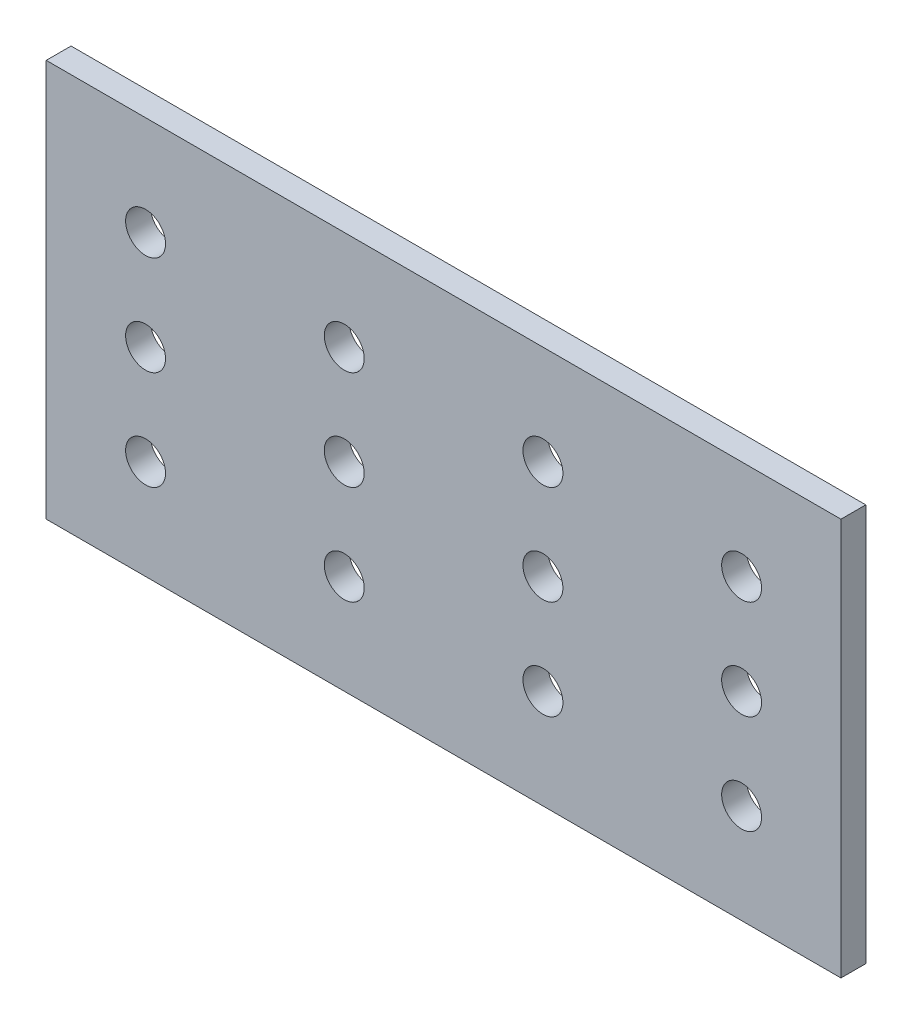
ISO-10303-21;
HEADER;
FILE_DESCRIPTION(('STEP AP214'),'2;1');
FILE_NAME('part.step','',(''),(''),'','','');
FILE_SCHEMA(('AUTOMOTIVE_DESIGN { 1 0 10303 214 1 1 1 1 }'));
ENDSEC;
DATA;
#1=APPLICATION_CONTEXT('core data for automotive mechanical design processes');
#2=APPLICATION_PROTOCOL_DEFINITION('international standard','automotive_design',2000,#1);
#3=PRODUCT_CONTEXT('',#1,'mechanical');
#4=PRODUCT('Part','Part','',(#3));
#5=PRODUCT_RELATED_PRODUCT_CATEGORY('part','',(#4));
#6=PRODUCT_DEFINITION_FORMATION('','',#4);
#7=PRODUCT_DEFINITION_CONTEXT('part definition',#1,'design');
#8=PRODUCT_DEFINITION('design','',#6,#7);
#9=PRODUCT_DEFINITION_SHAPE('','',#8);
#10=(LENGTH_UNIT() NAMED_UNIT(*) SI_UNIT(.MILLI.,.METRE.));
#11=(NAMED_UNIT(*) PLANE_ANGLE_UNIT() SI_UNIT($,.RADIAN.));
#12=(NAMED_UNIT(*) SI_UNIT($,.STERADIAN.) SOLID_ANGLE_UNIT());
#13=UNCERTAINTY_MEASURE_WITH_UNIT(LENGTH_MEASURE(1.E-05),#10,'distance_accuracy_value','');
#14=(GEOMETRIC_REPRESENTATION_CONTEXT(3) GLOBAL_UNCERTAINTY_ASSIGNED_CONTEXT((#13)) GLOBAL_UNIT_ASSIGNED_CONTEXT((#10,
#11,#12)) REPRESENTATION_CONTEXT('',''));
#15=CARTESIAN_POINT('',(0.,0.,0.));
#16=DIRECTION('',(0.,0.,1.));
#17=DIRECTION('',(1.,0.,0.));
#18=AXIS2_PLACEMENT_3D('',#15,#16,#17);
#19=CARTESIAN_POINT('',(-50.8,25.4,3.175));
#20=DIRECTION('',(1.,0.,0.));
#21=DIRECTION('',(0.,1.,0.));
#22=AXIS2_PLACEMENT_3D('',#19,#20,#21);
#23=PLANE('',#22);
#24=DIRECTION('',(0.,-1.,0.));
#25=VECTOR('',#24,1.);
#26=CARTESIAN_POINT('',(-50.8,25.4,0.));
#27=LINE('',#26,#25);
#28=CARTESIAN_POINT('',(-50.8,25.4,0.));
#29=VERTEX_POINT('',#28);
#30=CARTESIAN_POINT('',(-50.8,-25.4,0.));
#31=VERTEX_POINT('',#30);
#32=EDGE_CURVE('E96',#29,#31,#27,.T.);
#33=ORIENTED_EDGE('',*,*,#32,.T.);
#34=DIRECTION('',(0.,0.,-1.));
#35=VECTOR('',#34,1.);
#36=CARTESIAN_POINT('',(-50.8,-25.4,3.175));
#37=LINE('',#36,#35);
#38=CARTESIAN_POINT('',(-50.8,-25.4,3.175));
#39=VERTEX_POINT('',#38);
#40=EDGE_CURVE('E11',#39,#31,#37,.T.);
#41=ORIENTED_EDGE('',*,*,#40,.F.);
#42=DIRECTION('',(0.,-1.,0.));
#43=VECTOR('',#42,1.);
#44=CARTESIAN_POINT('',(-50.8,25.4,3.175));
#45=LINE('',#44,#43);
#46=CARTESIAN_POINT('',(-50.8,25.4,3.175));
#47=VERTEX_POINT('',#46);
#48=EDGE_CURVE('E84',#47,#39,#45,.T.);
#49=ORIENTED_EDGE('',*,*,#48,.F.);
#50=DIRECTION('',(0.,0.,-1.));
#51=VECTOR('',#50,1.);
#52=CARTESIAN_POINT('',(-50.8,25.4,3.175));
#53=LINE('',#52,#51);
#54=EDGE_CURVE('E92',#47,#29,#53,.T.);
#55=ORIENTED_EDGE('',*,*,#54,.T.);
#56=EDGE_LOOP('',(#33,#41,#49,#55));
#57=FACE_BOUND('',#56,.T.);
#58=ADVANCED_FACE('F33',(#57),#23,.F.);
#59=CARTESIAN_POINT('',(-50.8,-25.4,3.175));
#60=DIRECTION('',(0.,1.,0.));
#61=DIRECTION('',(0.,0.,1.));
#62=AXIS2_PLACEMENT_3D('',#59,#60,#61);
#63=PLANE('',#62);
#64=DIRECTION('',(1.,0.,0.));
#65=VECTOR('',#64,1.);
#66=CARTESIAN_POINT('',(-50.8,-25.4,0.));
#67=LINE('',#66,#65);
#68=CARTESIAN_POINT('',(50.8,-25.4,0.));
#69=VERTEX_POINT('',#68);
#70=EDGE_CURVE('E88',#31,#69,#67,.T.);
#71=ORIENTED_EDGE('',*,*,#70,.T.);
#72=DIRECTION('',(0.,0.,-1.));
#73=VECTOR('',#72,1.);
#74=CARTESIAN_POINT('',(50.8,-25.4,3.175));
#75=LINE('',#74,#73);
#76=CARTESIAN_POINT('',(50.8,-25.4,3.175));
#77=VERTEX_POINT('',#76);
#78=EDGE_CURVE('E41',#77,#69,#75,.T.);
#79=ORIENTED_EDGE('',*,*,#78,.F.);
#80=DIRECTION('',(1.,0.,0.));
#81=VECTOR('',#80,1.);
#82=CARTESIAN_POINT('',(-50.8,-25.4,3.175));
#83=LINE('',#82,#81);
#84=EDGE_CURVE('E79',#39,#77,#83,.T.);
#85=ORIENTED_EDGE('',*,*,#84,.F.);
#86=ORIENTED_EDGE('',*,*,#40,.T.);
#87=EDGE_LOOP('',(#71,#79,#85,#86));
#88=FACE_BOUND('',#87,.T.);
#89=ADVANCED_FACE('F87',(#88),#63,.F.);
#90=CARTESIAN_POINT('',(50.8,25.4,3.175));
#91=DIRECTION('',(-1.,0.,0.));
#92=DIRECTION('',(0.,0.,1.));
#93=AXIS2_PLACEMENT_3D('',#90,#91,#92);
#94=PLANE('',#93);
#95=DIRECTION('',(0.,1.,0.));
#96=VECTOR('',#95,1.);
#97=CARTESIAN_POINT('',(50.8,25.4,0.));
#98=LINE('',#97,#96);
#99=CARTESIAN_POINT('',(50.8,25.4,0.));
#100=VERTEX_POINT('',#99);
#101=EDGE_CURVE('E66',#69,#100,#98,.T.);
#102=ORIENTED_EDGE('',*,*,#101,.T.);
#103=DIRECTION('',(0.,0.,-1.));
#104=VECTOR('',#103,1.);
#105=CARTESIAN_POINT('',(50.8,25.4,3.175));
#106=LINE('',#105,#104);
#107=CARTESIAN_POINT('',(50.8,25.4,3.175));
#108=VERTEX_POINT('',#107);
#109=EDGE_CURVE('E89',#108,#100,#106,.T.);
#110=ORIENTED_EDGE('',*,*,#109,.F.);
#111=DIRECTION('',(0.,1.,0.));
#112=VECTOR('',#111,1.);
#113=CARTESIAN_POINT('',(50.8,25.4,3.175));
#114=LINE('',#113,#112);
#115=EDGE_CURVE('E82',#77,#108,#114,.T.);
#116=ORIENTED_EDGE('',*,*,#115,.F.);
#117=ORIENTED_EDGE('',*,*,#78,.T.);
#118=EDGE_LOOP('',(#102,#110,#116,#117));
#119=FACE_BOUND('',#118,.T.);
#120=ADVANCED_FACE('F90',(#119),#94,.F.);
#121=CARTESIAN_POINT('',(-50.8,25.4,3.175));
#122=DIRECTION('',(0.,-1.,0.));
#123=DIRECTION('',(0.,0.,-1.));
#124=AXIS2_PLACEMENT_3D('',#121,#122,#123);
#125=PLANE('',#124);
#126=DIRECTION('',(-1.,0.,0.));
#127=VECTOR('',#126,1.);
#128=CARTESIAN_POINT('',(-50.8,25.4,0.));
#129=LINE('',#128,#127);
#130=EDGE_CURVE('E72',#100,#29,#129,.T.);
#131=ORIENTED_EDGE('',*,*,#130,.T.);
#132=ORIENTED_EDGE('',*,*,#54,.F.);
#133=DIRECTION('',(-1.,0.,0.));
#134=VECTOR('',#133,1.);
#135=CARTESIAN_POINT('',(-50.8,25.4,3.175));
#136=LINE('',#135,#134);
#137=EDGE_CURVE('E49',#108,#47,#136,.T.);
#138=ORIENTED_EDGE('',*,*,#137,.F.);
#139=ORIENTED_EDGE('',*,*,#109,.T.);
#140=EDGE_LOOP('',(#131,#132,#138,#139));
#141=FACE_BOUND('',#140,.T.);
#142=ADVANCED_FACE('F104',(#141),#125,.F.);
#143=CARTESIAN_POINT('',(0.,0.,3.175));
#144=DIRECTION('',(0.,0.,1.));
#145=DIRECTION('',(1.,0.,0.));
#146=AXIS2_PLACEMENT_3D('',#143,#144,#145);
#147=PLANE('',#146);
#148=CARTESIAN_POINT('',(12.7000000000003,-12.7,3.175));
#149=DIRECTION('',(0.,0.,1.));
#150=DIRECTION('',(1.,0.,0.));
#151=AXIS2_PLACEMENT_3D('',#148,#149,#150);
#152=CIRCLE('',#151,2.5527);
#153=CARTESIAN_POINT('',(15.2527000000003,-12.7,3.175));
#154=VERTEX_POINT('',#153);
#155=EDGE_CURVE('E140',#154,#154,#152,.T.);
#156=ORIENTED_EDGE('',*,*,#155,.F.);
#157=EDGE_LOOP('',(#156));
#158=FACE_BOUND('',#157,.T.);
#159=CARTESIAN_POINT('',(-12.6999999999997,-12.7,3.175));
#160=DIRECTION('',(0.,0.,1.));
#161=DIRECTION('',(1.,0.,0.));
#162=AXIS2_PLACEMENT_3D('',#159,#160,#161);
#163=CIRCLE('',#162,2.5527);
#164=CARTESIAN_POINT('',(-10.1472999999997,-12.7,3.175));
#165=VERTEX_POINT('',#164);
#166=EDGE_CURVE('E147',#165,#165,#163,.T.);
#167=ORIENTED_EDGE('',*,*,#166,.F.);
#168=EDGE_LOOP('',(#167));
#169=FACE_BOUND('',#168,.T.);
#170=CARTESIAN_POINT('',(38.1000000000001,0.,3.175));
#171=DIRECTION('',(0.,0.,1.));
#172=DIRECTION('',(1.,0.,0.));
#173=AXIS2_PLACEMENT_3D('',#170,#171,#172);
#174=CIRCLE('',#173,2.5527);
#175=CARTESIAN_POINT('',(40.6527000000001,0.,3.175));
#176=VERTEX_POINT('',#175);
#177=EDGE_CURVE('E153',#176,#176,#174,.T.);
#178=ORIENTED_EDGE('',*,*,#177,.F.);
#179=EDGE_LOOP('',(#178));
#180=FACE_BOUND('',#179,.T.);
#181=CARTESIAN_POINT('',(12.7000000000001,0.,3.175));
#182=DIRECTION('',(0.,0.,1.));
#183=DIRECTION('',(1.,0.,0.));
#184=AXIS2_PLACEMENT_3D('',#181,#182,#183);
#185=CIRCLE('',#184,2.5527);
#186=CARTESIAN_POINT('',(15.2527000000001,0.,3.175));
#187=VERTEX_POINT('',#186);
#188=EDGE_CURVE('E159',#187,#187,#185,.T.);
#189=ORIENTED_EDGE('',*,*,#188,.F.);
#190=EDGE_LOOP('',(#189));
#191=FACE_BOUND('',#190,.T.);
#192=CARTESIAN_POINT('',(-12.7,12.7,3.175));
#193=DIRECTION('',(0.,0.,1.));
#194=DIRECTION('',(1.,0.,0.));
#195=AXIS2_PLACEMENT_3D('',#192,#193,#194);
#196=CIRCLE('',#195,2.5527);
#197=CARTESIAN_POINT('',(-10.1473,12.7,3.175));
#198=VERTEX_POINT('',#197);
#199=EDGE_CURVE('E123',#198,#198,#196,.T.);
#200=ORIENTED_EDGE('',*,*,#199,.F.);
#201=EDGE_LOOP('',(#200));
#202=FACE_BOUND('',#201,.T.);
#203=CARTESIAN_POINT('',(12.7,12.7,3.175));
#204=DIRECTION('',(0.,0.,1.));
#205=DIRECTION('',(1.,0.,0.));
#206=AXIS2_PLACEMENT_3D('',#203,#204,#205);
#207=CIRCLE('',#206,2.5527);
#208=CARTESIAN_POINT('',(15.2527,12.7,3.175));
#209=VERTEX_POINT('',#208);
#210=EDGE_CURVE('E116',#209,#209,#207,.T.);
#211=ORIENTED_EDGE('',*,*,#210,.F.);
#212=EDGE_LOOP('',(#211));
#213=FACE_BOUND('',#212,.T.);
#214=CARTESIAN_POINT('',(38.1,12.7,3.175));
#215=DIRECTION('',(0.,0.,1.));
#216=DIRECTION('',(1.,0.,0.));
#217=AXIS2_PLACEMENT_3D('',#214,#215,#216);
#218=CIRCLE('',#217,2.5527);
#219=CARTESIAN_POINT('',(40.6527,12.7,3.175));
#220=VERTEX_POINT('',#219);
#221=EDGE_CURVE('E135',#220,#220,#218,.T.);
#222=ORIENTED_EDGE('',*,*,#221,.F.);
#223=EDGE_LOOP('',(#222));
#224=FACE_BOUND('',#223,.T.);
#225=CARTESIAN_POINT('',(-12.6999999999999,0.,3.175));
#226=DIRECTION('',(0.,0.,1.));
#227=DIRECTION('',(1.,0.,0.));
#228=AXIS2_PLACEMENT_3D('',#225,#226,#227);
#229=CIRCLE('',#228,2.5527);
#230=CARTESIAN_POINT('',(-10.1472999999999,0.,3.175));
#231=VERTEX_POINT('',#230);
#232=EDGE_CURVE('E128',#231,#231,#229,.T.);
#233=ORIENTED_EDGE('',*,*,#232,.F.);
#234=EDGE_LOOP('',(#233));
#235=FACE_BOUND('',#234,.T.);
#236=CARTESIAN_POINT('',(-38.0999999999997,-12.7,3.175));
#237=DIRECTION('',(0.,0.,1.));
#238=DIRECTION('',(1.,0.,0.));
#239=AXIS2_PLACEMENT_3D('',#236,#237,#238);
#240=CIRCLE('',#239,2.5527);
#241=CARTESIAN_POINT('',(-35.5472999999997,-12.7,3.175));
#242=VERTEX_POINT('',#241);
#243=EDGE_CURVE('E176',#242,#242,#240,.T.);
#244=ORIENTED_EDGE('',*,*,#243,.F.);
#245=EDGE_LOOP('',(#244));
#246=FACE_BOUND('',#245,.T.);
#247=CARTESIAN_POINT('',(-38.0999999999999,0.,3.175));
#248=DIRECTION('',(0.,0.,1.));
#249=DIRECTION('',(1.,0.,0.));
#250=AXIS2_PLACEMENT_3D('',#247,#248,#249);
#251=CIRCLE('',#250,2.5527);
#252=CARTESIAN_POINT('',(-35.5472999999999,0.,3.175));
#253=VERTEX_POINT('',#252);
#254=EDGE_CURVE('E164',#253,#253,#251,.T.);
#255=ORIENTED_EDGE('',*,*,#254,.F.);
#256=EDGE_LOOP('',(#255));
#257=FACE_BOUND('',#256,.T.);
#258=CARTESIAN_POINT('',(38.1000000000003,-12.7,3.175));
#259=DIRECTION('',(0.,0.,1.));
#260=DIRECTION('',(1.,0.,0.));
#261=AXIS2_PLACEMENT_3D('',#258,#259,#260);
#262=CIRCLE('',#261,2.5527);
#263=CARTESIAN_POINT('',(40.6527000000003,-12.7,3.175));
#264=VERTEX_POINT('',#263);
#265=EDGE_CURVE('E171',#264,#264,#262,.T.);
#266=ORIENTED_EDGE('',*,*,#265,.F.);
#267=EDGE_LOOP('',(#266));
#268=FACE_BOUND('',#267,.T.);
#269=CARTESIAN_POINT('',(-38.1,12.7,3.175));
#270=DIRECTION('',(0.,0.,1.));
#271=DIRECTION('',(1.,0.,0.));
#272=AXIS2_PLACEMENT_3D('',#269,#270,#271);
#273=CIRCLE('',#272,2.5527);
#274=CARTESIAN_POINT('',(-35.5473,12.7,3.175));
#275=VERTEX_POINT('',#274);
#276=EDGE_CURVE('E110',#275,#275,#273,.T.);
#277=ORIENTED_EDGE('',*,*,#276,.F.);
#278=EDGE_LOOP('',(#277));
#279=FACE_BOUND('',#278,.T.);
#280=ORIENTED_EDGE('',*,*,#48,.T.);
#281=ORIENTED_EDGE('',*,*,#84,.T.);
#282=ORIENTED_EDGE('',*,*,#115,.T.);
#283=ORIENTED_EDGE('',*,*,#137,.T.);
#284=EDGE_LOOP('',(#280,#281,#282,#283));
#285=FACE_BOUND('',#284,.T.);
#286=ADVANCED_FACE('F80',(#158,#169,#180,#191,#202,#213,#224,#235,#246,#257,#268,#279,#285),
#147,.T.);
#287=CARTESIAN_POINT('',(0.,0.,0.));
#288=DIRECTION('',(0.,0.,1.));
#289=DIRECTION('',(1.,0.,0.));
#290=AXIS2_PLACEMENT_3D('',#287,#288,#289);
#291=PLANE('',#290);
#292=CARTESIAN_POINT('',(12.7000000000003,-12.7,0.));
#293=DIRECTION('',(0.,0.,1.));
#294=DIRECTION('',(1.,0.,0.));
#295=AXIS2_PLACEMENT_3D('',#292,#293,#294);
#296=CIRCLE('',#295,2.5527);
#297=CARTESIAN_POINT('',(15.2527000000003,-12.7,0.));
#298=VERTEX_POINT('',#297);
#299=EDGE_CURVE('E143',#298,#298,#296,.T.);
#300=ORIENTED_EDGE('',*,*,#299,.T.);
#301=EDGE_LOOP('',(#300));
#302=FACE_BOUND('',#301,.T.);
#303=CARTESIAN_POINT('',(-12.6999999999997,-12.7,0.));
#304=DIRECTION('',(0.,0.,1.));
#305=DIRECTION('',(1.,0.,0.));
#306=AXIS2_PLACEMENT_3D('',#303,#304,#305);
#307=CIRCLE('',#306,2.5527);
#308=CARTESIAN_POINT('',(-10.1472999999997,-12.7,0.));
#309=VERTEX_POINT('',#308);
#310=EDGE_CURVE('E150',#309,#309,#307,.T.);
#311=ORIENTED_EDGE('',*,*,#310,.T.);
#312=EDGE_LOOP('',(#311));
#313=FACE_BOUND('',#312,.T.);
#314=CARTESIAN_POINT('',(38.1000000000001,0.,0.));
#315=DIRECTION('',(0.,0.,1.));
#316=DIRECTION('',(1.,0.,0.));
#317=AXIS2_PLACEMENT_3D('',#314,#315,#316);
#318=CIRCLE('',#317,2.5527);
#319=CARTESIAN_POINT('',(40.6527000000001,0.,0.));
#320=VERTEX_POINT('',#319);
#321=EDGE_CURVE('E156',#320,#320,#318,.T.);
#322=ORIENTED_EDGE('',*,*,#321,.T.);
#323=EDGE_LOOP('',(#322));
#324=FACE_BOUND('',#323,.T.);
#325=CARTESIAN_POINT('',(12.7000000000001,0.,0.));
#326=DIRECTION('',(0.,0.,1.));
#327=DIRECTION('',(1.,0.,0.));
#328=AXIS2_PLACEMENT_3D('',#325,#326,#327);
#329=CIRCLE('',#328,2.5527);
#330=CARTESIAN_POINT('',(15.2527000000001,0.,0.));
#331=VERTEX_POINT('',#330);
#332=EDGE_CURVE('E132',#331,#331,#329,.T.);
#333=ORIENTED_EDGE('',*,*,#332,.T.);
#334=EDGE_LOOP('',(#333));
#335=FACE_BOUND('',#334,.T.);
#336=CARTESIAN_POINT('',(-12.7,12.7,0.));
#337=DIRECTION('',(0.,0.,1.));
#338=DIRECTION('',(1.,0.,0.));
#339=AXIS2_PLACEMENT_3D('',#336,#337,#338);
#340=CIRCLE('',#339,2.5527);
#341=CARTESIAN_POINT('',(-10.1473,12.7,0.));
#342=VERTEX_POINT('',#341);
#343=EDGE_CURVE('E113',#342,#342,#340,.T.);
#344=ORIENTED_EDGE('',*,*,#343,.T.);
#345=EDGE_LOOP('',(#344));
#346=FACE_BOUND('',#345,.T.);
#347=CARTESIAN_POINT('',(12.7,12.7,0.));
#348=DIRECTION('',(0.,0.,1.));
#349=DIRECTION('',(1.,0.,0.));
#350=AXIS2_PLACEMENT_3D('',#347,#348,#349);
#351=CIRCLE('',#350,2.5527);
#352=CARTESIAN_POINT('',(15.2527,12.7,0.));
#353=VERTEX_POINT('',#352);
#354=EDGE_CURVE('E119',#353,#353,#351,.T.);
#355=ORIENTED_EDGE('',*,*,#354,.T.);
#356=EDGE_LOOP('',(#355));
#357=FACE_BOUND('',#356,.T.);
#358=CARTESIAN_POINT('',(38.1,12.7,0.));
#359=DIRECTION('',(0.,0.,1.));
#360=DIRECTION('',(1.,0.,0.));
#361=AXIS2_PLACEMENT_3D('',#358,#359,#360);
#362=CIRCLE('',#361,2.5527);
#363=CARTESIAN_POINT('',(40.6527,12.7,0.));
#364=VERTEX_POINT('',#363);
#365=EDGE_CURVE('E120',#364,#364,#362,.T.);
#366=ORIENTED_EDGE('',*,*,#365,.T.);
#367=EDGE_LOOP('',(#366));
#368=FACE_BOUND('',#367,.T.);
#369=CARTESIAN_POINT('',(-12.6999999999999,0.,0.));
#370=DIRECTION('',(0.,0.,1.));
#371=DIRECTION('',(1.,0.,0.));
#372=AXIS2_PLACEMENT_3D('',#369,#370,#371);
#373=CIRCLE('',#372,2.5527);
#374=CARTESIAN_POINT('',(-10.1472999999999,0.,0.));
#375=VERTEX_POINT('',#374);
#376=EDGE_CURVE('E131',#375,#375,#373,.T.);
#377=ORIENTED_EDGE('',*,*,#376,.T.);
#378=EDGE_LOOP('',(#377));
#379=FACE_BOUND('',#378,.T.);
#380=CARTESIAN_POINT('',(-38.0999999999997,-12.7,0.));
#381=DIRECTION('',(0.,0.,1.));
#382=DIRECTION('',(1.,0.,0.));
#383=AXIS2_PLACEMENT_3D('',#380,#381,#382);
#384=CIRCLE('',#383,2.5527);
#385=CARTESIAN_POINT('',(-35.5472999999997,-12.7,0.));
#386=VERTEX_POINT('',#385);
#387=EDGE_CURVE('E168',#386,#386,#384,.T.);
#388=ORIENTED_EDGE('',*,*,#387,.T.);
#389=EDGE_LOOP('',(#388));
#390=FACE_BOUND('',#389,.T.);
#391=CARTESIAN_POINT('',(-38.0999999999999,0.,0.));
#392=DIRECTION('',(0.,0.,1.));
#393=DIRECTION('',(1.,0.,0.));
#394=AXIS2_PLACEMENT_3D('',#391,#392,#393);
#395=CIRCLE('',#394,2.5527);
#396=CARTESIAN_POINT('',(-35.5472999999999,0.,0.));
#397=VERTEX_POINT('',#396);
#398=EDGE_CURVE('E167',#397,#397,#395,.T.);
#399=ORIENTED_EDGE('',*,*,#398,.T.);
#400=EDGE_LOOP('',(#399));
#401=FACE_BOUND('',#400,.T.);
#402=CARTESIAN_POINT('',(38.1000000000003,-12.7,0.));
#403=DIRECTION('',(0.,0.,1.));
#404=DIRECTION('',(1.,0.,0.));
#405=AXIS2_PLACEMENT_3D('',#402,#403,#404);
#406=CIRCLE('',#405,2.5527);
#407=CARTESIAN_POINT('',(40.6527000000003,-12.7,0.));
#408=VERTEX_POINT('',#407);
#409=EDGE_CURVE('E144',#408,#408,#406,.T.);
#410=ORIENTED_EDGE('',*,*,#409,.T.);
#411=EDGE_LOOP('',(#410));
#412=FACE_BOUND('',#411,.T.);
#413=CARTESIAN_POINT('',(-38.1,12.7,0.));
#414=DIRECTION('',(0.,0.,1.));
#415=DIRECTION('',(1.,0.,0.));
#416=AXIS2_PLACEMENT_3D('',#413,#414,#415);
#417=CIRCLE('',#416,2.5527);
#418=CARTESIAN_POINT('',(-35.5473,12.7,0.));
#419=VERTEX_POINT('',#418);
#420=EDGE_CURVE('E99',#419,#419,#417,.T.);
#421=ORIENTED_EDGE('',*,*,#420,.T.);
#422=EDGE_LOOP('',(#421));
#423=FACE_BOUND('',#422,.T.);
#424=ORIENTED_EDGE('',*,*,#32,.F.);
#425=ORIENTED_EDGE('',*,*,#130,.F.);
#426=ORIENTED_EDGE('',*,*,#101,.F.);
#427=ORIENTED_EDGE('',*,*,#70,.F.);
#428=EDGE_LOOP('',(#424,#425,#426,#427));
#429=FACE_BOUND('',#428,.T.);
#430=ADVANCED_FACE('F107',(#302,#313,#324,#335,#346,#357,#368,#379,#390,#401,#412,#423,#429),
#291,.F.);
#431=CARTESIAN_POINT('',(-38.1,12.7,0.));
#432=DIRECTION('',(0.,0.,1.));
#433=DIRECTION('',(1.,0.,0.));
#434=AXIS2_PLACEMENT_3D('',#431,#432,#433);
#435=CYLINDRICAL_SURFACE('',#434,2.5527);
#436=ORIENTED_EDGE('',*,*,#420,.F.);
#437=EDGE_LOOP('',(#436));
#438=FACE_BOUND('',#437,.T.);
#439=ORIENTED_EDGE('',*,*,#276,.T.);
#440=EDGE_LOOP('',(#439));
#441=FACE_BOUND('',#440,.T.);
#442=ADVANCED_FACE('F202',(#438,#441),#435,.F.);
#443=CARTESIAN_POINT('',(38.1000000000003,-12.7,0.));
#444=DIRECTION('',(0.,0.,1.));
#445=DIRECTION('',(1.,0.,0.));
#446=AXIS2_PLACEMENT_3D('',#443,#444,#445);
#447=CYLINDRICAL_SURFACE('',#446,2.5527);
#448=ORIENTED_EDGE('',*,*,#409,.F.);
#449=EDGE_LOOP('',(#448));
#450=FACE_BOUND('',#449,.T.);
#451=ORIENTED_EDGE('',*,*,#265,.T.);
#452=EDGE_LOOP('',(#451));
#453=FACE_BOUND('',#452,.T.);
#454=ADVANCED_FACE('F204',(#450,#453),#447,.F.);
#455=CARTESIAN_POINT('',(-38.0999999999999,0.,0.));
#456=DIRECTION('',(0.,0.,1.));
#457=DIRECTION('',(1.,0.,0.));
#458=AXIS2_PLACEMENT_3D('',#455,#456,#457);
#459=CYLINDRICAL_SURFACE('',#458,2.5527);
#460=ORIENTED_EDGE('',*,*,#398,.F.);
#461=EDGE_LOOP('',(#460));
#462=FACE_BOUND('',#461,.T.);
#463=ORIENTED_EDGE('',*,*,#254,.T.);
#464=EDGE_LOOP('',(#463));
#465=FACE_BOUND('',#464,.T.);
#466=ADVANCED_FACE('F188',(#462,#465),#459,.F.);
#467=CARTESIAN_POINT('',(-38.0999999999997,-12.7,0.));
#468=DIRECTION('',(0.,0.,1.));
#469=DIRECTION('',(1.,0.,0.));
#470=AXIS2_PLACEMENT_3D('',#467,#468,#469);
#471=CYLINDRICAL_SURFACE('',#470,2.5527);
#472=ORIENTED_EDGE('',*,*,#387,.F.);
#473=EDGE_LOOP('',(#472));
#474=FACE_BOUND('',#473,.T.);
#475=ORIENTED_EDGE('',*,*,#243,.T.);
#476=EDGE_LOOP('',(#475));
#477=FACE_BOUND('',#476,.T.);
#478=ADVANCED_FACE('F184',(#474,#477),#471,.F.);
#479=CARTESIAN_POINT('',(-12.6999999999999,0.,0.));
#480=DIRECTION('',(0.,0.,1.));
#481=DIRECTION('',(1.,0.,0.));
#482=AXIS2_PLACEMENT_3D('',#479,#480,#481);
#483=CYLINDRICAL_SURFACE('',#482,2.5527);
#484=ORIENTED_EDGE('',*,*,#376,.F.);
#485=EDGE_LOOP('',(#484));
#486=FACE_BOUND('',#485,.T.);
#487=ORIENTED_EDGE('',*,*,#232,.T.);
#488=EDGE_LOOP('',(#487));
#489=FACE_BOUND('',#488,.T.);
#490=ADVANCED_FACE('F187',(#486,#489),#483,.F.);
#491=CARTESIAN_POINT('',(38.1,12.7,0.));
#492=DIRECTION('',(0.,0.,1.));
#493=DIRECTION('',(1.,0.,0.));
#494=AXIS2_PLACEMENT_3D('',#491,#492,#493);
#495=CYLINDRICAL_SURFACE('',#494,2.5527);
#496=ORIENTED_EDGE('',*,*,#365,.F.);
#497=EDGE_LOOP('',(#496));
#498=FACE_BOUND('',#497,.T.);
#499=ORIENTED_EDGE('',*,*,#221,.T.);
#500=EDGE_LOOP('',(#499));
#501=FACE_BOUND('',#500,.T.);
#502=ADVANCED_FACE('F273',(#498,#501),#495,.F.);
#503=CARTESIAN_POINT('',(12.7,12.7,0.));
#504=DIRECTION('',(0.,0.,1.));
#505=DIRECTION('',(1.,0.,0.));
#506=AXIS2_PLACEMENT_3D('',#503,#504,#505);
#507=CYLINDRICAL_SURFACE('',#506,2.5527);
#508=ORIENTED_EDGE('',*,*,#354,.F.);
#509=EDGE_LOOP('',(#508));
#510=FACE_BOUND('',#509,.T.);
#511=ORIENTED_EDGE('',*,*,#210,.T.);
#512=EDGE_LOOP('',(#511));
#513=FACE_BOUND('',#512,.T.);
#514=ADVANCED_FACE('F283',(#510,#513),#507,.F.);
#515=CARTESIAN_POINT('',(-12.7,12.7,0.));
#516=DIRECTION('',(0.,0.,1.));
#517=DIRECTION('',(1.,0.,0.));
#518=AXIS2_PLACEMENT_3D('',#515,#516,#517);
#519=CYLINDRICAL_SURFACE('',#518,2.5527);
#520=ORIENTED_EDGE('',*,*,#343,.F.);
#521=EDGE_LOOP('',(#520));
#522=FACE_BOUND('',#521,.T.);
#523=ORIENTED_EDGE('',*,*,#199,.T.);
#524=EDGE_LOOP('',(#523));
#525=FACE_BOUND('',#524,.T.);
#526=ADVANCED_FACE('F293',(#522,#525),#519,.F.);
#527=CARTESIAN_POINT('',(12.7000000000001,0.,0.));
#528=DIRECTION('',(0.,0.,1.));
#529=DIRECTION('',(1.,0.,0.));
#530=AXIS2_PLACEMENT_3D('',#527,#528,#529);
#531=CYLINDRICAL_SURFACE('',#530,2.5527);
#532=ORIENTED_EDGE('',*,*,#332,.F.);
#533=EDGE_LOOP('',(#532));
#534=FACE_BOUND('',#533,.T.);
#535=ORIENTED_EDGE('',*,*,#188,.T.);
#536=EDGE_LOOP('',(#535));
#537=FACE_BOUND('',#536,.T.);
#538=ADVANCED_FACE('F302',(#534,#537),#531,.F.);
#539=CARTESIAN_POINT('',(38.1000000000001,0.,0.));
#540=DIRECTION('',(0.,0.,1.));
#541=DIRECTION('',(1.,0.,0.));
#542=AXIS2_PLACEMENT_3D('',#539,#540,#541);
#543=CYLINDRICAL_SURFACE('',#542,2.5527);
#544=ORIENTED_EDGE('',*,*,#321,.F.);
#545=EDGE_LOOP('',(#544));
#546=FACE_BOUND('',#545,.T.);
#547=ORIENTED_EDGE('',*,*,#177,.T.);
#548=EDGE_LOOP('',(#547));
#549=FACE_BOUND('',#548,.T.);
#550=ADVANCED_FACE('F312',(#546,#549),#543,.F.);
#551=CARTESIAN_POINT('',(-12.6999999999997,-12.7,0.));
#552=DIRECTION('',(0.,0.,1.));
#553=DIRECTION('',(1.,0.,0.));
#554=AXIS2_PLACEMENT_3D('',#551,#552,#553);
#555=CYLINDRICAL_SURFACE('',#554,2.5527);
#556=ORIENTED_EDGE('',*,*,#310,.F.);
#557=EDGE_LOOP('',(#556));
#558=FACE_BOUND('',#557,.T.);
#559=ORIENTED_EDGE('',*,*,#166,.T.);
#560=EDGE_LOOP('',(#559));
#561=FACE_BOUND('',#560,.T.);
#562=ADVANCED_FACE('F322',(#558,#561),#555,.F.);
#563=CARTESIAN_POINT('',(12.7000000000003,-12.7,0.));
#564=DIRECTION('',(0.,0.,1.));
#565=DIRECTION('',(1.,0.,0.));
#566=AXIS2_PLACEMENT_3D('',#563,#564,#565);
#567=CYLINDRICAL_SURFACE('',#566,2.5527);
#568=ORIENTED_EDGE('',*,*,#299,.F.);
#569=EDGE_LOOP('',(#568));
#570=FACE_BOUND('',#569,.T.);
#571=ORIENTED_EDGE('',*,*,#155,.T.);
#572=EDGE_LOOP('',(#571));
#573=FACE_BOUND('',#572,.T.);
#574=ADVANCED_FACE('F332',(#570,#573),#567,.F.);
#575=CLOSED_SHELL('',(#58,#89,#120,#142,#286,#430,#442,#454,#466,#478,#490,#502,#514,#526,#538,
#550,#562,#574));
#576=MANIFOLD_SOLID_BREP('B2',#575);
#577=ADVANCED_BREP_SHAPE_REPRESENTATION('',(#18,#576),#14);
#578=SHAPE_DEFINITION_REPRESENTATION(#9,#577);
ENDSEC;
END-ISO-10303-21;
